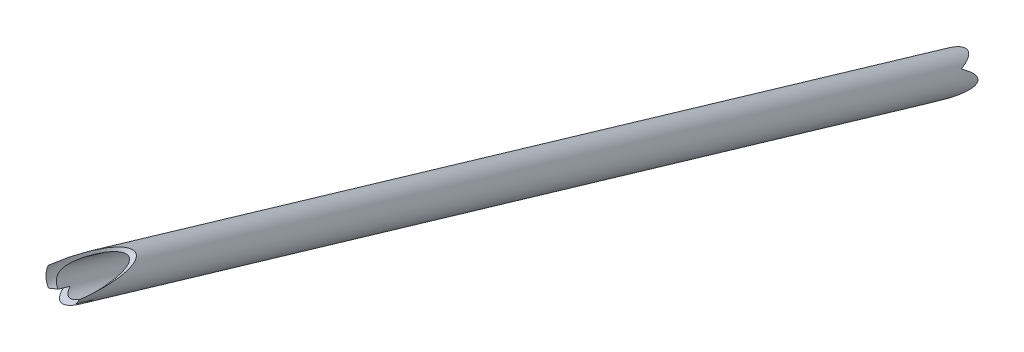
ISO-10303-21;
HEADER;
FILE_DESCRIPTION(('STEP AP214'),'2;1');
FILE_NAME('part.step','',(''),(''),'','','');
FILE_SCHEMA(('AUTOMOTIVE_DESIGN { 1 0 10303 214 1 1 1 1 }'));
ENDSEC;
DATA;
#1=APPLICATION_CONTEXT('core data for automotive mechanical design processes');
#2=APPLICATION_PROTOCOL_DEFINITION('international standard','automotive_design',2000,#1);
#3=PRODUCT_CONTEXT('',#1,'mechanical');
#4=PRODUCT('Part','Part','',(#3));
#5=PRODUCT_RELATED_PRODUCT_CATEGORY('part','',(#4));
#6=PRODUCT_DEFINITION_FORMATION('','',#4);
#7=PRODUCT_DEFINITION_CONTEXT('part definition',#1,'design');
#8=PRODUCT_DEFINITION('design','',#6,#7);
#9=PRODUCT_DEFINITION_SHAPE('','',#8);
#10=(LENGTH_UNIT() NAMED_UNIT(*) SI_UNIT(.MILLI.,.METRE.));
#11=(NAMED_UNIT(*) PLANE_ANGLE_UNIT() SI_UNIT($,.RADIAN.));
#12=(NAMED_UNIT(*) SI_UNIT($,.STERADIAN.) SOLID_ANGLE_UNIT());
#13=UNCERTAINTY_MEASURE_WITH_UNIT(LENGTH_MEASURE(1.E-05),#10,'distance_accuracy_value','');
#14=(GEOMETRIC_REPRESENTATION_CONTEXT(3) GLOBAL_UNCERTAINTY_ASSIGNED_CONTEXT((#13)) GLOBAL_UNIT_ASSIGNED_CONTEXT((#10,
#11,#12)) REPRESENTATION_CONTEXT('',''));
#15=CARTESIAN_POINT('',(0.,0.,0.));
#16=DIRECTION('',(0.,0.,1.));
#17=DIRECTION('',(1.,0.,0.));
#18=AXIS2_PLACEMENT_3D('',#15,#16,#17);
#19=CARTESIAN_POINT('',(325.000000000001,320.,-1580.));
#20=DIRECTION('',(-0.0876619818920292,-0.105194378270435,0.99058039537993));
#21=DIRECTION('',(0.,-0.994408591727349,-0.105600912395825));
#22=AXIS2_PLACEMENT_3D('',#19,#20,#21);
#23=CYLINDRICAL_SURFACE('',#22,9.49999999999999);
#24=CARTESIAN_POINT('',(221.867816341129,196.143749159579,-483.439555991757));
#25=CARTESIAN_POINT('',(221.744916160208,196.211668608643,-483.254483271431));
#26=CARTESIAN_POINT('',(221.628324397993,196.27741003886,-483.064434145934));
#27=CARTESIAN_POINT('',(221.405381897496,196.40520054438,-482.677173192087));
#28=CARTESIAN_POINT('',(221.299036384405,196.467247729662,-482.479957779064));
#29=CARTESIAN_POINT('',(221.094722569846,196.588233197143,-482.079869555906));
#30=CARTESIAN_POINT('',(220.996769110364,196.647165903406,-481.876987531015));
#31=CARTESIAN_POINT('',(220.808106971487,196.76220870086,-481.467091110527));
#32=CARTESIAN_POINT('',(220.717399102247,196.81831847615,-481.26007625605));
#33=CARTESIAN_POINT('',(220.541813375875,196.92826866127,-480.841828435643));
#34=CARTESIAN_POINT('',(220.456964047748,196.982097531836,-480.630580519424));
#35=CARTESIAN_POINT('',(220.292732870649,197.087459194095,-480.205404649806));
#36=CARTESIAN_POINT('',(220.213351205379,197.138991908622,-479.991476606646));
#37=CARTESIAN_POINT('',(220.059492858198,197.239894790773,-479.561653903778));
#38=CARTESIAN_POINT('',(219.985010672734,197.289267363238,-479.345761771849));
#39=CARTESIAN_POINT('',(219.84032483991,197.386063326967,-478.912120246465));
#40=CARTESIAN_POINT('',(219.770121194234,197.433486717466,-478.694370852278));
#41=CARTESIAN_POINT('',(219.611235492152,197.541705407719,-478.18586386051));
#42=CARTESIAN_POINT('',(219.524012279107,197.601805937094,-477.894502338488));
#43=CARTESIAN_POINT('',(219.355495073532,197.718996721296,-477.309463055435));
#44=CARTESIAN_POINT('',(219.274201405272,197.776086811444,-477.015785168699));
#45=CARTESIAN_POINT('',(219.038161124765,197.943089892068,-476.131731064247));
#46=CARTESIAN_POINT('',(218.891285135204,198.04871511148,-475.538431900938));
#47=CARTESIAN_POINT('',(218.614321907698,198.249219814499,-474.345171795147));
#48=CARTESIAN_POINT('',(218.48426168193,198.344081979554,-473.745201775097));
#49=CARTESIAN_POINT('',(218.238416767254,198.522684937343,-472.540784300971));
#50=CARTESIAN_POINT('',(218.122630419714,198.606427022323,-471.936337375782));
#51=CARTESIAN_POINT('',(217.903550106691,198.761714414035,-470.725530130133));
#52=CARTESIAN_POINT('',(217.800219763331,198.833295500733,-470.119180963039));
#53=CARTESIAN_POINT('',(217.604052309476,198.962892447269,-468.903269795343));
#54=CARTESIAN_POINT('',(217.511216409307,199.020906743269,-468.29370743263));
#55=CARTESIAN_POINT('',(217.334942156074,199.120501961816,-467.07267000562));
#56=CARTESIAN_POINT('',(217.251491495074,199.162104590833,-466.461198553209));
#57=CARTESIAN_POINT('',(217.132658010012,199.208763740849,-465.542440772346));
#58=CARTESIAN_POINT('',(217.094106897586,199.22169223469,-465.235955492854));
#59=CARTESIAN_POINT('',(217.019067397391,199.241444156039,-464.622540849505));
#60=CARTESIAN_POINT('',(216.982578900346,199.248267907255,-464.315611510061));
#61=CARTESIAN_POINT('',(216.926255468311,199.253413256068,-463.827828169511));
#62=CARTESIAN_POINT('',(216.905747168516,199.25407820214,-463.647075683772));
#63=CARTESIAN_POINT('',(216.865457539614,199.252650787272,-463.285503008026));
#64=CARTESIAN_POINT('',(216.845676205905,199.250558443792,-463.104682818456));
#65=CARTESIAN_POINT('',(216.787443226148,199.239696747833,-462.56210985902));
#66=CARTESIAN_POINT('',(216.750109746554,199.226341877992,-462.200306500772));
#67=CARTESIAN_POINT('',(216.678824096418,199.18428872109,-461.477287867453));
#68=CARTESIAN_POINT('',(216.644871328104,199.155593152283,-461.116072499564));
#69=CARTESIAN_POINT('',(216.581179922428,199.07859171637,-460.395351758092));
#70=CARTESIAN_POINT('',(216.551439866713,199.030292470784,-460.035845848546));
#71=CARTESIAN_POINT('',(216.506809190398,198.928680904948,-459.440058806582));
#72=CARTESIAN_POINT('',(216.490275715329,198.882424889167,-459.202706408005));
#73=CARTESIAN_POINT('',(216.460672843694,198.776527515429,-458.730705734551));
#74=CARTESIAN_POINT('',(216.447603756455,198.716884963093,-458.496057702931));
#75=CARTESIAN_POINT('',(216.426170590661,198.582049333451,-458.031521573671));
#76=CARTESIAN_POINT('',(216.417796737998,198.506889009544,-457.801624554583));
#77=CARTESIAN_POINT('',(216.407425887977,198.338644150316,-457.348316698097));
#78=CARTESIAN_POINT('',(216.405426181493,198.245567247702,-457.124903145129));
#79=CARTESIAN_POINT('',(216.409457610542,198.066713913394,-456.744803099227));
#80=CARTESIAN_POINT('',(216.413520002955,197.985425401619,-456.585984050997));
#81=CARTESIAN_POINT('',(216.427426827669,197.811770910355,-456.274707372152));
#82=CARTESIAN_POINT('',(216.437272161122,197.719403206188,-456.122250736954));
#83=CARTESIAN_POINT('',(216.46387279183,197.52385776409,-455.825247686903));
#84=CARTESIAN_POINT('',(216.480621587151,197.420690265828,-455.680693973498));
#85=CARTESIAN_POINT('',(216.522128185501,197.204276630719,-455.400638672308));
#86=CARTESIAN_POINT('',(216.546882604756,197.091034766684,-455.265133289166));
#87=CARTESIAN_POINT('',(216.605463231152,196.855385755286,-455.003625005794));
#88=CARTESIAN_POINT('',(216.6393184676,196.732950199039,-454.877654195637));
#89=CARTESIAN_POINT('',(216.716814345511,196.481017555598,-454.63622481022));
#90=CARTESIAN_POINT('',(216.76045535416,196.351520203565,-454.520766629649));
#91=CARTESIAN_POINT('',(216.858064418465,196.087330631981,-454.300328353861));
#92=CARTESIAN_POINT('',(216.912044685767,195.952632421443,-454.195360874512));
#93=CARTESIAN_POINT('',(217.030533146528,195.68024182227,-453.995785273929));
#94=CARTESIAN_POINT('',(217.095041547552,195.542549374649,-453.901177356999));
#95=CARTESIAN_POINT('',(217.232742034125,195.269808708802,-453.724199014216));
#96=CARTESIAN_POINT('',(217.305656787346,195.134787851641,-453.641569594441));
#97=CARTESIAN_POINT('',(217.46134130987,194.865387394159,-453.485047920033));
#98=CARTESIAN_POINT('',(217.54411072979,194.731007771279,-453.411155355834));
#99=CARTESIAN_POINT('',(217.719261302306,194.464327600343,-453.27148522532));
#100=CARTESIAN_POINT('',(217.811642237152,194.332027005264,-453.205707475236));
#101=CARTESIAN_POINT('',(218.005695939184,194.070750843874,-453.081664943344));
#102=CARTESIAN_POINT('',(218.1073696985,193.941775634481,-453.023400965335));
#103=CARTESIAN_POINT('',(218.335248063992,193.669588028607,-452.905783284654));
#104=CARTESIAN_POINT('',(218.462860413534,193.527075175984,-452.847532064646));
#105=CARTESIAN_POINT('',(218.72912233136,193.249325491925,-452.739517459189));
#106=CARTESIAN_POINT('',(218.867772754017,193.114089225075,-452.689754731709));
#107=CARTESIAN_POINT('',(219.155413034993,192.85207753954,-452.598136201992));
#108=CARTESIAN_POINT('',(219.304407166969,192.725305660992,-452.556283694885));
#109=CARTESIAN_POINT('',(219.611858949618,192.481349622085,-452.480074062194));
#110=CARTESIAN_POINT('',(219.770316838821,192.364165703565,-452.445717125635));
#111=CARTESIAN_POINT('',(220.109310666581,192.131018020471,-452.381627200325));
#112=CARTESIAN_POINT('',(220.290588015345,192.015960114282,-452.352513337755));
#113=CARTESIAN_POINT('',(220.662010660155,191.799139256937,-452.302436513258));
#114=CARTESIAN_POINT('',(220.852156465534,191.697377070661,-452.281474020129));
#115=CARTESIAN_POINT('',(221.240057517242,191.507944733428,-452.247574438816));
#116=CARTESIAN_POINT('',(221.437813550495,191.420276044666,-452.234638182953));
#117=CARTESIAN_POINT('',(221.839571717603,191.25967682333,-452.216798399914));
#118=CARTESIAN_POINT('',(222.043573836935,191.186746256491,-452.211894854062));
#119=CARTESIAN_POINT('',(222.460346744699,191.054841534376,-452.210234633353));
#120=CARTESIAN_POINT('',(222.673210489742,190.996158823983,-452.21363449189));
#121=CARTESIAN_POINT('',(223.102420649295,190.894875782086,-452.229185314935));
#122=CARTESIAN_POINT('',(223.318767134247,190.852275776303,-452.241336456667));
#123=CARTESIAN_POINT('',(223.75337176501,190.783255146456,-452.274816996316));
#124=CARTESIAN_POINT('',(223.971630299334,190.756837891745,-452.296148304029));
#125=CARTESIAN_POINT('',(224.408331200445,190.720087475749,-452.34857486001));
#126=CARTESIAN_POINT('',(224.626773565782,190.709754188941,-452.379670032077));
#127=CARTESIAN_POINT('',(225.061235024494,190.704834857659,-452.45224630388));
#128=CARTESIAN_POINT('',(225.277260244977,190.710187581003,-452.493686442429));
#129=CARTESIAN_POINT('',(225.705920308937,190.735898595622,-452.587958750105));
#130=CARTESIAN_POINT('',(225.918555094214,190.756257144209,-452.640791114568));
#131=CARTESIAN_POINT('',(226.338485572319,190.811052667377,-452.7589861039));
#132=CARTESIAN_POINT('',(226.545781049353,190.845490210028,-452.824349234312));
#133=CARTESIAN_POINT('',(226.952918611937,190.927128235789,-452.968903638001));
#134=CARTESIAN_POINT('',(227.152761140274,190.974327959306,-453.04809408819));
#135=CARTESIAN_POINT('',(227.533400012803,191.077177724195,-453.217520024669));
#136=CARTESIAN_POINT('',(227.714650151432,191.132315108419,-453.307045345216));
#137=CARTESIAN_POINT('',(228.066297520654,191.250539602547,-453.500979127947));
#138=CARTESIAN_POINT('',(228.236695352959,191.31362627112,-453.605386763932));
#139=CARTESIAN_POINT('',(228.564230668756,191.445157806151,-453.829623548737));
#140=CARTESIAN_POINT('',(228.721396338926,191.513590651902,-453.949418469675));
#141=CARTESIAN_POINT('',(229.021023578724,191.653140163561,-454.204780377999));
#142=CARTESIAN_POINT('',(229.16348809366,191.724256287971,-454.340344194536));
#143=CARTESIAN_POINT('',(229.41292450994,191.85600620716,-454.605849042173));
#144=CARTESIAN_POINT('',(229.522048958777,191.916667233601,-454.733763493892));
#145=CARTESIAN_POINT('',(229.728211799186,192.036195586433,-454.999731167473));
#146=CARTESIAN_POINT('',(229.825251697605,192.095063135762,-455.137783121851));
#147=CARTESIAN_POINT('',(230.007373463917,192.209678852937,-455.422824446701));
#148=CARTESIAN_POINT('',(230.09245150077,192.265426017988,-455.569816658986));
#149=CARTESIAN_POINT('',(230.251158725905,192.372849835881,-455.871266575696));
#150=CARTESIAN_POINT('',(230.324786001723,192.424525808058,-456.025725521552));
#151=CARTESIAN_POINT('',(230.491893782597,192.545263969148,-456.41085023921));
#152=CARTESIAN_POINT('',(230.579606354445,192.611815748017,-456.64481101824));
#153=CARTESIAN_POINT('',(230.73608339229,192.734943603414,-457.121507827826));
#154=CARTESIAN_POINT('',(230.804836881089,192.791513893921,-457.364248850481));
#155=CARTESIAN_POINT('',(230.926850780584,192.895525726815,-457.856508546365));
#156=CARTESIAN_POINT('',(230.980048686292,192.942930187919,-458.10605027499));
#157=CARTESIAN_POINT('',(231.050077777795,193.007780014251,-458.483136477627));
#158=CARTESIAN_POINT('',(231.071791585063,193.028352504075,-458.609284583955));
#159=CARTESIAN_POINT('',(231.112272270366,193.067567089045,-458.86235469012));
#160=CARTESIAN_POINT('',(231.131039132399,193.08620917371,-458.989276694157));
#161=CARTESIAN_POINT('',(231.17615148261,193.132139486391,-459.318494536617));
#162=CARTESIAN_POINT('',(231.200470616647,193.158071703137,-459.521257967902));
#163=CARTESIAN_POINT('',(231.243333192966,193.206000771984,-459.927866767373));
#164=CARTESIAN_POINT('',(231.26187581131,193.227997062491,-460.131712285689));
#165=CARTESIAN_POINT('',(231.310049725158,193.288888427878,-460.744536062788));
#166=CARTESIAN_POINT('',(231.332203400636,193.322661316153,-461.154616995256));
#167=CARTESIAN_POINT('',(231.361185406054,193.380075230227,-461.976861907257));
#168=CARTESIAN_POINT('',(231.367978476856,193.403692845001,-462.389028507095));
#169=CARTESIAN_POINT('',(231.369103974054,193.443321940916,-463.213612341065));
#170=CARTESIAN_POINT('',(231.363439562237,193.459335350798,-463.626029485048));
#171=CARTESIAN_POINT('',(231.341573251862,193.485836306886,-464.452734085275));
#172=CARTESIAN_POINT('',(231.325320569671,193.49629677891,-464.867020949912));
#173=CARTESIAN_POINT('',(231.28353326303,193.513138451371,-465.695220076253));
#174=CARTESIAN_POINT('',(231.257998142731,193.519519433838,-466.10913231676));
#175=CARTESIAN_POINT('',(231.198520703874,193.529421377823,-466.935819192715));
#176=CARTESIAN_POINT('',(231.164589751624,193.532946178694,-467.3485946095));
#177=CARTESIAN_POINT('',(231.088797998772,193.538135390998,-468.173416497182));
#178=CARTESIAN_POINT('',(231.046937364706,193.539799841496,-468.585462983205));
#179=CARTESIAN_POINT('',(230.957192895731,193.542047568486,-469.393656268349));
#180=CARTESIAN_POINT('',(230.909585161682,193.542668141634,-469.789833698334));
#181=CARTESIAN_POINT('',(230.807253307228,193.543582155229,-470.581269626729));
#182=CARTESIAN_POINT('',(230.752529181054,193.54387559541,-470.976528124393));
#183=CARTESIAN_POINT('',(230.635796775659,193.544715313732,-471.766180531893));
#184=CARTESIAN_POINT('',(230.573784702022,193.545261724019,-472.160573881476));
#185=CARTESIAN_POINT('',(230.442200258311,193.5471602204,-472.948095380819));
#186=CARTESIAN_POINT('',(230.372627946943,193.548512300239,-473.341223540379));
#187=CARTESIAN_POINT('',(230.225735753467,193.552568629242,-474.124439147908));
#188=CARTESIAN_POINT('',(230.148447170497,193.555267580203,-474.51453247509));
#189=CARTESIAN_POINT('',(229.985229767397,193.562595194581,-475.292886833795));
#190=CARTESIAN_POINT('',(229.899301157776,193.567223810992,-475.681147909719));
#191=CARTESIAN_POINT('',(229.717928003543,193.579057479342,-476.45519439509));
#192=CARTESIAN_POINT('',(229.622488543763,193.586261159836,-476.840981011285));
#193=CARTESIAN_POINT('',(229.420807989039,193.604012287094,-477.609626751348));
#194=CARTESIAN_POINT('',(229.314567853172,193.614559437139,-477.99248613191));
#195=CARTESIAN_POINT('',(229.08921605326,193.639998439099,-478.75550187341));
#196=CARTESIAN_POINT('',(228.970067369157,193.654903006864,-479.135646939301));
#197=CARTESIAN_POINT('',(228.716642691621,193.690334109843,-479.890895163065));
#198=CARTESIAN_POINT('',(228.582359187191,193.71086344377,-480.26599571321));
#199=CARTESIAN_POINT('',(228.36666539381,193.747297359257,-480.823514992684));
#200=CARTESIAN_POINT('',(228.292243346376,193.760410530268,-481.008826461906));
#201=CARTESIAN_POINT('',(228.138054296144,193.788838744115,-481.377033523942));
#202=CARTESIAN_POINT('',(228.05828781673,193.804153571509,-481.559929351226));
#203=CARTESIAN_POINT('',(227.892709734126,193.837360535127,-481.922540693631));
#204=CARTESIAN_POINT('',(227.80690363926,193.855250338064,-482.102258924316));
#205=CARTESIAN_POINT('',(227.628218575537,193.894114749759,-482.457780940701));
#206=CARTESIAN_POINT('',(227.535341121229,193.915088698843,-482.633585554257));
#207=CARTESIAN_POINT('',(227.339933738749,193.961083230077,-482.982403594736));
#208=CARTESIAN_POINT('',(227.237290627789,193.986154522503,-483.155347509662));
#209=CARTESIAN_POINT('',(227.021798913808,194.041024658014,-483.493912455869));
#210=CARTESIAN_POINT('',(226.908956720128,194.070820540818,-483.65953799008));
#211=CARTESIAN_POINT('',(226.671788508869,194.136101462158,-483.97921584504));
#212=CARTESIAN_POINT('',(226.54756038629,194.171539636301,-484.133349345435));
#213=CARTESIAN_POINT('',(226.284480408958,194.249781850905,-484.426318436764));
#214=CARTESIAN_POINT('',(226.145663711551,194.292568333607,-484.565189227695));
#215=CARTESIAN_POINT('',(225.893271863142,194.373735887258,-484.783000418827));
#216=CARTESIAN_POINT('',(225.783964380261,194.409828246808,-484.867673743931));
#217=CARTESIAN_POINT('',(225.556071352559,194.487366788917,-485.02092629597));
#218=CARTESIAN_POINT('',(225.437484631547,194.52881365062,-485.089503478219));
#219=CARTESIAN_POINT('',(225.190296103563,194.617849253,-485.20581978616));
#220=CARTESIAN_POINT('',(225.061585526406,194.665509823685,-485.253280928538));
#221=CARTESIAN_POINT('',(224.798975001602,194.765711885296,-485.320445145522));
#222=CARTESIAN_POINT('',(224.665085392124,194.81824391819,-485.340200855744));
#223=CARTESIAN_POINT('',(224.413909925345,194.919602498945,-485.349146010604));
#224=CARTESIAN_POINT('',(224.296599390322,194.968094602781,-485.341783523988));
#225=CARTESIAN_POINT('',(224.065650173055,195.065740919288,-485.305432718721));
#226=CARTESIAN_POINT('',(223.952015422913,195.114895766167,-485.276421991716));
#227=CARTESIAN_POINT('',(223.696384419221,195.227757382886,-485.188161940121));
#228=CARTESIAN_POINT('',(223.556601101996,195.291219398924,-485.122302174962));
#229=CARTESIAN_POINT('',(223.289200176931,195.415452681419,-484.967515784066));
#230=CARTESIAN_POINT('',(223.161611308771,195.476217418992,-484.878536419013));
#231=CARTESIAN_POINT('',(222.924944215343,195.591222665065,-484.689884214583));
#232=CARTESIAN_POINT('',(222.81522740797,195.645637814069,-484.591099734463));
#233=CARTESIAN_POINT('',(222.604785905404,195.751793378589,-484.382970182887));
#234=CARTESIAN_POINT('',(222.504070684171,195.803530952471,-484.273614231337));
#235=CARTESIAN_POINT('',(222.310185866234,195.904662423471,-484.046804218292));
#236=CARTESIAN_POINT('',(222.217040840576,195.954048488929,-483.9293259114));
#237=CARTESIAN_POINT('',(222.037569046049,196.050539955631,-483.68851301665));
#238=CARTESIAN_POINT('',(221.951239385987,196.097646320645,-483.565180947995));
#239=CARTESIAN_POINT('',(221.867816341129,196.143749159579,-483.439555991757));
#240=B_SPLINE_CURVE_WITH_KNOTS('',3,(#24,#25,#26,#27,#28,#29,#30,#31,#32,#33,#34,#35,#36,#37,
#38,#39,#40,#41,#42,#43,#44,#45,#46,#47,#48,#49,#50,#51,#52,#53,#54,#55,#56,#57,#58,#59,#60,#61,
#62,#63,#64,#65,#66,#67,#68,#69,#70,#71,#72,#73,#74,#75,#76,#77,#78,#79,#80,#81,#82,#83,#84,#85,
#86,#87,#88,#89,#90,#91,#92,#93,#94,#95,#96,#97,#98,#99,#100,#101,#102,#103,#104,#105,#106,#107,
#108,#109,#110,#111,#112,#113,#114,#115,#116,#117,#118,#119,#120,#121,#122,#123,#124,#125,#126,
#127,#128,#129,#130,#131,#132,#133,#134,#135,#136,#137,#138,#139,#140,#141,#142,#143,#144,#145,
#146,#147,#148,#149,#150,#151,#152,#153,#154,#155,#156,#157,#158,#159,#160,#161,#162,#163,#164,
#165,#166,#167,#168,#169,#170,#171,#172,#173,#174,#175,#176,#177,#178,#179,#180,#181,#182,#183,
#184,#185,#186,#187,#188,#189,#190,#191,#192,#193,#194,#195,#196,#197,#198,#199,#200,#201,#202,
#203,#204,#205,#206,#207,#208,#209,#210,#211,#212,#213,#214,#215,#216,#217,#218,#219,#220,#221,
#222,#223,#224,#225,#226,#227,#228,#229,#230,#231,#232,#233,#234,#235,#236,#237,#238,#239),
.UNSPECIFIED.,.T.,.F.,(4,2,2,2,2,2,2,2,2,2,2,2,2,2,2,2,2,2,2,2,2,2,2,2,2,2,2,2,2,2,2,2,2,2,2,2,
2,2,2,2,2,2,2,2,2,2,2,2,2,2,2,2,2,2,2,2,2,2,2,2,2,2,2,2,2,2,2,2,2,2,2,2,2,2,2,2,2,2,2,2,2,2,2,2,
2,2,2,2,2,2,2,2,2,2,2,2,2,2,2,2,2,2,2,2,2,2,2,4),(0.,0.696850558231176,1.39405462302003,
2.09246733246744,2.79095802506804,3.49263992056985,4.19434537941575,4.89524866033255,
5.59615221691092,6.5261100887369,7.45611877937455,9.31644801876279,11.1797294401652,
13.0427941428578,14.9002786827179,16.7579772286356,18.6132104325809,19.5406716085716,
20.4680836023737,21.0138034041009,21.5595197501111,22.6511390141223,23.7425649156482,
24.8336224734311,25.560446354833,26.2873351110505,27.0127050251043,27.7377666028737,
28.2726615970744,28.8076399658165,29.3421156195375,29.8763656586433,30.4123404676854,
30.9483353911708,31.4849673234057,32.0216098367865,32.5439465412635,33.0662647325857,
33.5885710932614,34.1109332823014,34.7102013488927,35.3095158453838,35.9090794483622,
36.5086581694871,37.157923719559,37.8072266043442,38.4565968106437,39.1059655071447,
39.7676700787861,40.4293880511509,41.0912437506679,41.7530942849225,42.4123646537878,
43.0716463277709,43.7309546055367,44.3902236505212,45.0179344763702,45.6456104681204,
46.2719136671147,46.8980911445221,47.433628161306,47.9690983339547,48.5047396135363,
49.0404702580801,49.8148656609237,50.5897084972379,51.3676232976142,51.7565223810442,
52.1454235761618,52.7628390795759,53.3803426083102,54.6159117510441,55.854314185023,
57.0924023410606,58.3364727915225,59.5806097075373,60.8230714346854,62.065507071232,
63.2625274254983,64.4595487502649,65.6571960796385,66.8548341098322,68.0477976798303,
69.2407321908696,70.4330323045907,71.6252266368044,72.8209353723991,74.0172401402614,
74.6175447405776,75.2177906383599,75.8174960140407,76.4170733036793,77.0247282187937,
77.6320038897871,78.2344761186536,78.8355283575045,79.2632227445772,79.6909714321561,
80.1241956911317,80.5565957774282,80.9360241581975,81.3158458355911,81.8141724501048,
82.3136459586879,82.7848959984054,83.2566363167252,83.7298512517704,84.2028643502327),.UNSPECIFIED.);
#241=CARTESIAN_POINT('',(229.535426909998,191.925076824245,-454.754165653931));
#242=VERTEX_POINT('',#241);
#243=CARTESIAN_POINT('',(219.301386014973,192.730719815019,-452.558788504073));
#244=VERTEX_POINT('',#243);
#245=EDGE_CURVE('E45',#242,#244,#240,.T.);
#246=ORIENTED_EDGE('',*,*,#245,.F.);
#247=CARTESIAN_POINT('',(223.816060398079,198.579272477694,-436.621482498284));
#248=DIRECTION('',(0.,-0.938783490773443,0.344507703036127));
#249=DIRECTION('',(-0.0976202983177511,0.342862242025731,0.934299609520116));
#250=AXIS2_PLACEMENT_3D('',#247,#248,#249);
#251=ELLIPSE('',#250,21.5900591134705,9.49999999999999);
#252=CARTESIAN_POINT('',(232.31027832483,193.934010848774,-449.279820437089));
#253=VERTEX_POINT('',#252);
#254=EDGE_CURVE('E149',#253,#242,#251,.F.);
#255=ORIENTED_EDGE('',*,*,#254,.F.);
#256=CARTESIAN_POINT('',(225.,200.,-449.999999999999));
#257=DIRECTION('',(-0.00393166272219695,-0.122566257616363,-0.992452545224283));
#258=DIRECTION('',(-0.375454370679205,-0.91967060235529,0.115065193265994));
#259=AXIS2_PLACEMENT_3D('',#256,#257,#258);
#260=ELLIPSE('',#259,9.79516660998725,9.49999999999999);
#261=CARTESIAN_POINT('',(233.804909131862,196.455806088392,-449.597179076289));
#262=VERTEX_POINT('',#261);
#263=EDGE_CURVE('E150',#253,#262,#260,.F.);
#264=ORIENTED_EDGE('',*,*,#263,.T.);
#265=CARTESIAN_POINT('',(225.,200.,-449.999999999999));
#266=DIRECTION('',(-0.375454370679205,-0.91967060235529,0.115065193265994));
#267=DIRECTION('',(-0.00393166272219695,-0.122566257616363,-0.992452545224283));
#268=AXIS2_PLACEMENT_3D('',#265,#266,#267);
#269=ELLIPSE('',#268,38.9921832232021,9.49999999999999);
#270=CARTESIAN_POINT('',(216.195090868139,203.544193911608,-450.40282092371));
#271=VERTEX_POINT('',#270);
#272=EDGE_CURVE('E78',#262,#271,#269,.F.);
#273=ORIENTED_EDGE('',*,*,#272,.T.);
#274=CARTESIAN_POINT('',(225.,200.,-449.999999999999));
#275=DIRECTION('',(-0.00393166272219695,-0.122566257616363,-0.992452545224283));
#276=DIRECTION('',(-0.375454370679205,-0.91967060235529,0.115065193265994));
#277=AXIS2_PLACEMENT_3D('',#274,#275,#276);
#278=ELLIPSE('',#277,9.79516660998725,9.49999999999999);
#279=CARTESIAN_POINT('',(217.424826478928,193.954712860678,-449.223407454654));
#280=VERTEX_POINT('',#279);
#281=EDGE_CURVE('E74',#271,#280,#278,.F.);
#282=ORIENTED_EDGE('',*,*,#281,.T.);
#283=CARTESIAN_POINT('',(223.816060398079,198.579272477694,-436.621482498284));
#284=DIRECTION('',(0.,-0.938783490773443,0.344507703036127));
#285=DIRECTION('',(-0.0976202983177511,0.342862242025731,0.934299609520116));
#286=AXIS2_PLACEMENT_3D('',#283,#284,#285);
#287=ELLIPSE('',#286,21.5900591134705,9.49999999999999);
#288=EDGE_CURVE('E158',#244,#280,#287,.F.);
#289=ORIENTED_EDGE('',*,*,#288,.F.);
#290=EDGE_LOOP('',(#246,#255,#264,#273,#282,#289));
#291=FACE_BOUND('',#290,.T.);
#292=ADVANCED_FACE('F41',(#291),#23,.F.);
#293=CARTESIAN_POINT('',(505.307253864148,1198.81788023086,2289.02872362909));
#294=DIRECTION('',(0.,-0.938783490773443,0.344507703036127));
#295=DIRECTION('',(0.,-0.344507703036127,-0.938783490773443));
#296=AXIS2_PLACEMENT_3D('',#293,#294,#295);
#297=PLANE('',#296);
#298=DIRECTION('',(-0.0952883546426035,-0.34294009382942,-0.934511755685168));
#299=VECTOR('',#298,1.);
#300=CARTESIAN_POINT('',(498.849889873376,1198.81788023086,2289.02872362909));
#301=LINE('',#300,#299);
#302=CARTESIAN_POINT('',(218.542636009228,190.,-460.));
#303=VERTEX_POINT('',#302);
#304=EDGE_CURVE('E55',#244,#303,#301,.T.);
#305=ORIENTED_EDGE('',*,*,#304,.F.);
#306=ORIENTED_EDGE('',*,*,#288,.T.);
#307=DIRECTION('',(-0.0952883546426035,-0.34294009382942,-0.934511755685168));
#308=VECTOR('',#307,1.);
#309=CARTESIAN_POINT('',(496.633235126788,1198.81788023086,2289.02872362909));
#310=LINE('',#309,#308);
#311=CARTESIAN_POINT('',(216.32598126264,190.,-460.));
#312=VERTEX_POINT('',#311);
#313=EDGE_CURVE('E156',#280,#312,#310,.T.);
#314=ORIENTED_EDGE('',*,*,#313,.T.);
#315=DIRECTION('',(-1.,0.,0.));
#316=VECTOR('',#315,1.);
#317=CARTESIAN_POINT('',(225.,190.,-460.));
#318=LINE('',#317,#316);
#319=EDGE_CURVE('E11',#303,#312,#318,.T.);
#320=ORIENTED_EDGE('',*,*,#319,.F.);
#321=EDGE_LOOP('',(#305,#306,#314,#320));
#322=FACE_BOUND('',#321,.T.);
#323=ADVANCED_FACE('F163',(#322),#297,.T.);
#324=CARTESIAN_POINT('',(225.,200.,-450.));
#325=DIRECTION('',(-0.0952883546426035,-0.34294009382942,-0.934511755685167));
#326=DIRECTION('',(0.,0.938783490773443,-0.344507703036127));
#327=AXIS2_PLACEMENT_3D('',#324,#325,#326);
#328=CYLINDRICAL_SURFACE('',#327,7.90000000000002);
#329=ORIENTED_EDGE('',*,*,#304,.T.);
#330=CARTESIAN_POINT('',(222.221428571429,190.,-477.25));
#331=DIRECTION('',(0.,1.,0.));
#332=DIRECTION('',(-0.10143994949885,0.,-0.994841664108249));
#333=AXIS2_PLACEMENT_3D('',#330,#331,#332);
#334=ELLIPSE('',#333,23.0360933065164,7.90000000000002);
#335=CARTESIAN_POINT('',(229.000530563833,190.,-460.));
#336=VERTEX_POINT('',#335);
#337=EDGE_CURVE('E123',#303,#336,#334,.T.);
#338=ORIENTED_EDGE('',*,*,#337,.T.);
#339=DIRECTION('',(-0.0952883546426035,-0.34294009382942,-0.934511755685168));
#340=VECTOR('',#339,1.);
#341=CARTESIAN_POINT('',(509.307784427981,1198.81788023086,2289.02872362909));
#342=LINE('',#341,#340);
#343=EDGE_CURVE('E103',#242,#336,#342,.T.);
#344=ORIENTED_EDGE('',*,*,#343,.F.);
#345=ORIENTED_EDGE('',*,*,#245,.T.);
#346=EDGE_LOOP('',(#329,#338,#344,#345));
#347=FACE_BOUND('',#346,.T.);
#348=CARTESIAN_POINT('',(174.174415873268,17.0801599552079,-948.456564122057));
#349=DIRECTION('',(-0.993532672656404,0.,-0.113546591160732));
#350=DIRECTION('',(0.106361808887792,-0.350068968397217,-0.930665827768176));
#351=AXIS2_PLACEMENT_3D('',#348,#349,#350);
#352=ELLIPSE('',#351,39.3460158418403,7.90000000000002);
#353=CARTESIAN_POINT('',(177.789020867518,10.,-980.084357821745));
#354=VERTEX_POINT('',#353);
#355=CARTESIAN_POINT('',(173.763867136421,10.,-944.864262674639));
#356=VERTEX_POINT('',#355);
#357=EDGE_CURVE('E118',#354,#356,#352,.T.);
#358=ORIENTED_EDGE('',*,*,#357,.T.);
#359=CARTESIAN_POINT('',(172.207142857143,10.,-967.749999999999));
#360=DIRECTION('',(0.,-1.,0.));
#361=DIRECTION('',(-0.10143994949885,0.,-0.994841664108249));
#362=AXIS2_PLACEMENT_3D('',#359,#360,#361);
#363=ELLIPSE('',#362,23.0360933065164,7.90000000000002);
#364=EDGE_CURVE('E116',#356,#354,#363,.T.);
#365=ORIENTED_EDGE('',*,*,#364,.T.);
#366=EDGE_LOOP('',(#358,#365));
#367=FACE_BOUND('',#366,.T.);
#368=ADVANCED_FACE('F120',(#347,#367),#328,.F.);
#369=CARTESIAN_POINT('',(225.,200.,-450.));
#370=DIRECTION('',(-0.0952883546426035,-0.34294009382942,-0.934511755685167));
#371=DIRECTION('',(0.,0.938783490773443,-0.344507703036127));
#372=AXIS2_PLACEMENT_3D('',#369,#370,#371);
#373=CYLINDRICAL_SURFACE('',#372,9.49999999999999);
#374=ORIENTED_EDGE('',*,*,#272,.F.);
#375=ORIENTED_EDGE('',*,*,#263,.F.);
#376=DIRECTION('',(-0.0952883546426035,-0.34294009382942,-0.934511755685168));
#377=VECTOR('',#376,1.);
#378=CARTESIAN_POINT('',(511.524439174569,1198.81788023086,2289.02872362909));
#379=LINE('',#378,#377);
#380=CARTESIAN_POINT('',(231.217185310421,190.,-460.));
#381=VERTEX_POINT('',#380);
#382=EDGE_CURVE('E85',#253,#381,#379,.T.);
#383=ORIENTED_EDGE('',*,*,#382,.T.);
#384=CARTESIAN_POINT('',(222.221428571429,190.,-477.25));
#385=DIRECTION('',(0.,1.,0.));
#386=DIRECTION('',(-0.10143994949885,0.,-0.994841664108249));
#387=AXIS2_PLACEMENT_3D('',#384,#385,#386);
#388=ELLIPSE('',#387,27.7016311913804,9.49999999999999);
#389=EDGE_CURVE('E138',#312,#381,#388,.T.);
#390=ORIENTED_EDGE('',*,*,#389,.F.);
#391=ORIENTED_EDGE('',*,*,#313,.F.);
#392=ORIENTED_EDGE('',*,*,#281,.F.);
#393=EDGE_LOOP('',(#374,#375,#383,#390,#391,#392));
#394=FACE_BOUND('',#393,.T.);
#395=CARTESIAN_POINT('',(172.207142857143,10.,-967.749999999999));
#396=DIRECTION('',(0.,-1.,0.));
#397=DIRECTION('',(-0.10143994949885,0.,-0.994841664108249));
#398=AXIS2_PLACEMENT_3D('',#395,#396,#397);
#399=ELLIPSE('',#398,27.7016311913804,9.49999999999999);
#400=CARTESIAN_POINT('',(173.261818317503,10.,-940.471335509112));
#401=VERTEX_POINT('',#400);
#402=CARTESIAN_POINT('',(178.291069686436,10.,-984.477284987272));
#403=VERTEX_POINT('',#402);
#404=EDGE_CURVE('E143',#401,#403,#399,.T.);
#405=ORIENTED_EDGE('',*,*,#404,.F.);
#406=CARTESIAN_POINT('',(174.174415873268,17.0801599552079,-948.456564122057));
#407=DIRECTION('',(-0.993532672656404,0.,-0.113546591160732));
#408=DIRECTION('',(0.106361808887792,-0.350068968397217,-0.930665827768176));
#409=AXIS2_PLACEMENT_3D('',#406,#407,#408);
#410=ELLIPSE('',#409,47.3148291768964,9.49999999999999);
#411=EDGE_CURVE('E130',#403,#401,#410,.T.);
#412=ORIENTED_EDGE('',*,*,#411,.F.);
#413=EDGE_LOOP('',(#405,#412));
#414=FACE_BOUND('',#413,.T.);
#415=ADVANCED_FACE('F43',(#394,#414),#373,.T.);
#416=CARTESIAN_POINT('',(505.307253864148,1198.81788023086,2289.02872362909));
#417=DIRECTION('',(0.,-0.938783490773443,0.344507703036127));
#418=DIRECTION('',(0.,-0.344507703036127,-0.938783490773443));
#419=AXIS2_PLACEMENT_3D('',#416,#417,#418);
#420=PLANE('',#419);
#421=ORIENTED_EDGE('',*,*,#382,.F.);
#422=ORIENTED_EDGE('',*,*,#254,.T.);
#423=ORIENTED_EDGE('',*,*,#343,.T.);
#424=DIRECTION('',(-1.,0.,0.));
#425=VECTOR('',#424,1.);
#426=CARTESIAN_POINT('',(225.,190.,-460.));
#427=LINE('',#426,#425);
#428=EDGE_CURVE('E146',#381,#336,#427,.T.);
#429=ORIENTED_EDGE('',*,*,#428,.F.);
#430=EDGE_LOOP('',(#421,#422,#423,#429));
#431=FACE_BOUND('',#430,.T.);
#432=ADVANCED_FACE('F175',(#431),#420,.T.);
#433=CARTESIAN_POINT('',(259.935326726564,10.,-1698.86453408839));
#434=DIRECTION('',(-0.993532672656404,0.,-0.113546591160732));
#435=DIRECTION('',(-0.113546591160732,0.,0.993532672656404));
#436=AXIS2_PLACEMENT_3D('',#433,#434,#435);
#437=PLANE('',#436);
#438=DIRECTION('',(-0.113546591160732,0.,0.993532672656404));
#439=VECTOR('',#438,1.);
#440=CARTESIAN_POINT('',(259.935326726564,10.,-1698.86453408839));
#441=LINE('',#440,#439);
#442=EDGE_CURVE('E134',#403,#354,#441,.T.);
#443=ORIENTED_EDGE('',*,*,#442,.F.);
#444=ORIENTED_EDGE('',*,*,#411,.T.);
#445=DIRECTION('',(-0.113546591160732,0.,0.993532672656404));
#446=VECTOR('',#445,1.);
#447=CARTESIAN_POINT('',(259.935326726564,10.,-1698.86453408839));
#448=LINE('',#447,#446);
#449=EDGE_CURVE('E127',#356,#401,#448,.T.);
#450=ORIENTED_EDGE('',*,*,#449,.F.);
#451=ORIENTED_EDGE('',*,*,#357,.F.);
#452=EDGE_LOOP('',(#443,#444,#450,#451));
#453=FACE_BOUND('',#452,.T.);
#454=ADVANCED_FACE('F128',(#453),#437,.T.);
#455=CARTESIAN_POINT('',(225.,190.,-460.));
#456=DIRECTION('',(0.,1.,0.));
#457=DIRECTION('',(0.,0.,1.));
#458=AXIS2_PLACEMENT_3D('',#455,#456,#457);
#459=PLANE('',#458);
#460=ORIENTED_EDGE('',*,*,#319,.T.);
#461=ORIENTED_EDGE('',*,*,#389,.T.);
#462=ORIENTED_EDGE('',*,*,#428,.T.);
#463=ORIENTED_EDGE('',*,*,#337,.F.);
#464=EDGE_LOOP('',(#460,#461,#462,#463));
#465=FACE_BOUND('',#464,.T.);
#466=ADVANCED_FACE('F168',(#465),#459,.T.);
#467=CARTESIAN_POINT('',(-259.935326726564,10.,-1698.86453408839));
#468=DIRECTION('',(0.,-1.,0.));
#469=DIRECTION('',(0.,0.,-1.));
#470=AXIS2_PLACEMENT_3D('',#467,#468,#469);
#471=PLANE('',#470);
#472=ORIENTED_EDGE('',*,*,#404,.T.);
#473=ORIENTED_EDGE('',*,*,#442,.T.);
#474=ORIENTED_EDGE('',*,*,#364,.F.);
#475=ORIENTED_EDGE('',*,*,#449,.T.);
#476=EDGE_LOOP('',(#472,#473,#474,#475));
#477=FACE_BOUND('',#476,.T.);
#478=ADVANCED_FACE('F136',(#477),#471,.T.);
#479=CLOSED_SHELL('',(#292,#323,#368,#415,#432,#454,#466,#478));
#480=MANIFOLD_SOLID_BREP('B2',#479);
#481=ADVANCED_BREP_SHAPE_REPRESENTATION('',(#18,#480),#14);
#482=SHAPE_DEFINITION_REPRESENTATION(#9,#481);
ENDSEC;
END-ISO-10303-21;
